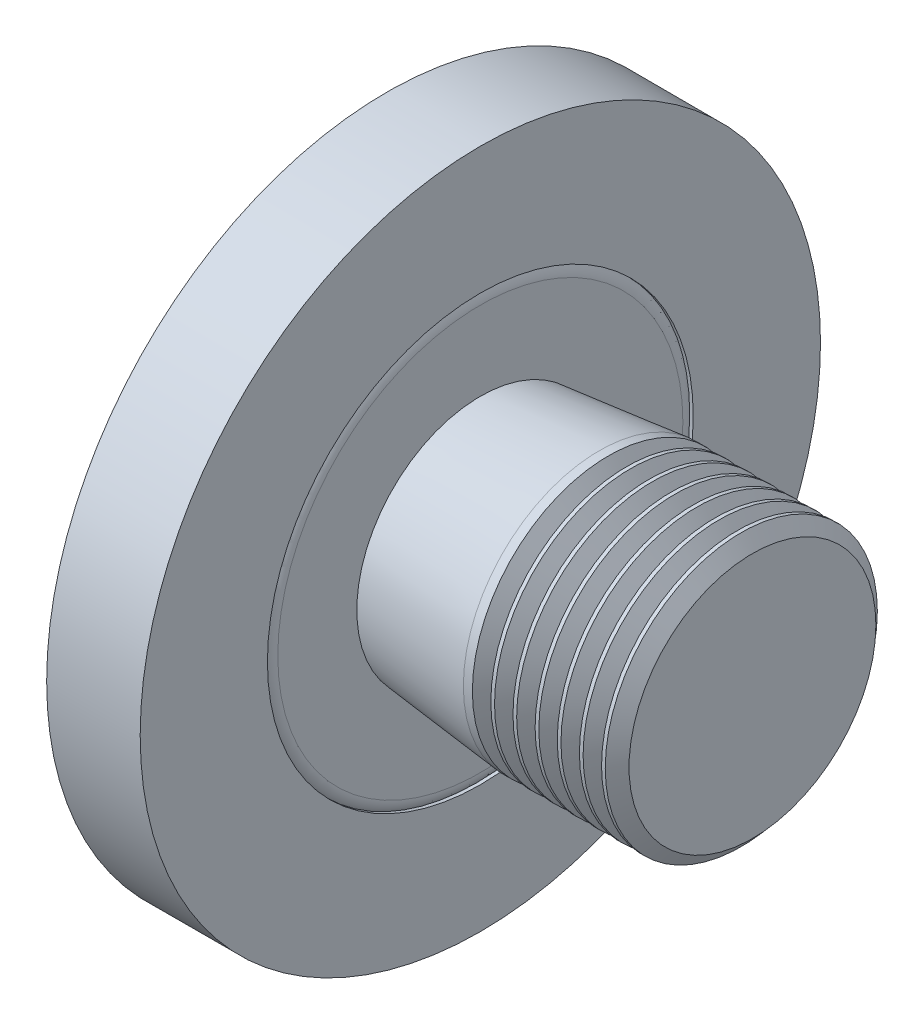
ISO-10303-21;
HEADER;
FILE_DESCRIPTION(('STEP AP214'),'2;1');
FILE_NAME('part.step','',(''),(''),'','','');
FILE_SCHEMA(('AUTOMOTIVE_DESIGN { 1 0 10303 214 1 1 1 1 }'));
ENDSEC;
DATA;
#1=APPLICATION_CONTEXT('core data for automotive mechanical design processes');
#2=APPLICATION_PROTOCOL_DEFINITION('international standard','automotive_design',2000,#1);
#3=PRODUCT_CONTEXT('',#1,'mechanical');
#4=PRODUCT('Part','Part','',(#3));
#5=PRODUCT_RELATED_PRODUCT_CATEGORY('part','',(#4));
#6=PRODUCT_DEFINITION_FORMATION('','',#4);
#7=PRODUCT_DEFINITION_CONTEXT('part definition',#1,'design');
#8=PRODUCT_DEFINITION('design','',#6,#7);
#9=PRODUCT_DEFINITION_SHAPE('','',#8);
#10=(LENGTH_UNIT() NAMED_UNIT(*) SI_UNIT(.MILLI.,.METRE.));
#11=(NAMED_UNIT(*) PLANE_ANGLE_UNIT() SI_UNIT($,.RADIAN.));
#12=(NAMED_UNIT(*) SI_UNIT($,.STERADIAN.) SOLID_ANGLE_UNIT());
#13=UNCERTAINTY_MEASURE_WITH_UNIT(LENGTH_MEASURE(1.E-05),#10,'distance_accuracy_value','');
#14=(GEOMETRIC_REPRESENTATION_CONTEXT(3) GLOBAL_UNCERTAINTY_ASSIGNED_CONTEXT((#13)) GLOBAL_UNIT_ASSIGNED_CONTEXT((#10,
#11,#12)) REPRESENTATION_CONTEXT('',''));
#15=CARTESIAN_POINT('',(0.,0.,0.));
#16=DIRECTION('',(0.,0.,1.));
#17=DIRECTION('',(1.,0.,0.));
#18=AXIS2_PLACEMENT_3D('',#15,#16,#17);
#19=CARTESIAN_POINT('',(0.45,0.,0.));
#20=DIRECTION('',(1.,0.,0.));
#21=DIRECTION('',(0.,0.,-1.));
#22=AXIS2_PLACEMENT_3D('',#19,#20,#21);
#23=TOROIDAL_SURFACE('',#22,1.19086914989307,0.1);
#24=CARTESIAN_POINT('',(0.55,0.,0.));
#25=DIRECTION('',(-1.,0.,0.));
#26=DIRECTION('',(0.,0.,-1.));
#27=AXIS2_PLACEMENT_3D('',#24,#25,#26);
#28=CIRCLE('',#27,1.19086914989307);
#29=CARTESIAN_POINT('',(0.55,0.,-1.19086914989307));
#30=VERTEX_POINT('',#29);
#31=CARTESIAN_POINT('',(0.55,0.,1.19086914989307));
#32=VERTEX_POINT('',#31);
#33=EDGE_CURVE('E135',#30,#32,#28,.T.);
#34=ORIENTED_EDGE('',*,*,#33,.T.);
#35=CARTESIAN_POINT('',(0.55,0.,0.));
#36=DIRECTION('',(-1.,0.,0.));
#37=DIRECTION('',(0.,0.,1.));
#38=AXIS2_PLACEMENT_3D('',#35,#36,#37);
#39=CIRCLE('',#38,1.19086914989307);
#40=EDGE_CURVE('E139',#32,#30,#39,.T.);
#41=ORIENTED_EDGE('',*,*,#40,.T.);
#42=EDGE_LOOP('',(#34,#41));
#43=FACE_BOUND('',#42,.T.);
#44=CARTESIAN_POINT('',(0.529230836567331,0.,0.));
#45=DIRECTION('',(1.,0.,0.));
#46=DIRECTION('',(0.,0.,-1.));
#47=AXIS2_PLACEMENT_3D('',#44,#45,#46);
#48=CIRCLE('',#47,1.25188123506348);
#49=CARTESIAN_POINT('',(0.529230836567331,0.,-1.25188123506348));
#50=VERTEX_POINT('',#49);
#51=EDGE_CURVE('E316',#50,#50,#48,.T.);
#52=ORIENTED_EDGE('',*,*,#51,.T.);
#53=EDGE_LOOP('',(#52));
#54=FACE_BOUND('',#53,.T.);
#55=ADVANCED_FACE('F31',(#43,#54),#23,.T.);
#56=CARTESIAN_POINT('',(2.19285000002856,0.,0.));
#57=DIRECTION('',(1.,0.,0.));
#58=DIRECTION('',(0.,0.,-1.));
#59=AXIS2_PLACEMENT_3D('',#56,#57,#58);
#60=CONICAL_SURFACE('',#59,0.800000000026557,1.04719755130005);
#61=CARTESIAN_POINT('',(2.13860000002342,0.,0.));
#62=DIRECTION('',(-1.,0.,0.));
#63=DIRECTION('',(0.,0.,1.));
#64=AXIS2_PLACEMENT_3D('',#61,#62,#63);
#65=CIRCLE('',#64,0.706036243741437);
#66=CARTESIAN_POINT('',(2.13860000002342,0.,0.706036243741437));
#67=VERTEX_POINT('',#66);
#68=EDGE_CURVE('E248',#67,#67,#65,.T.);
#69=ORIENTED_EDGE('',*,*,#68,.F.);
#70=EDGE_LOOP('',(#69));
#71=FACE_BOUND('',#70,.T.);
#72=CARTESIAN_POINT('',(2.15,0.,0.));
#73=DIRECTION('',(1.,0.,0.));
#74=DIRECTION('',(0.,0.,-1.));
#75=AXIS2_PLACEMENT_3D('',#72,#73,#74);
#76=CIRCLE('',#75,0.725781622855038);
#77=CARTESIAN_POINT('',(2.15,0.,-0.725781622855038));
#78=VERTEX_POINT('',#77);
#79=EDGE_CURVE('E35',#78,#78,#76,.F.);
#80=ORIENTED_EDGE('',*,*,#79,.T.);
#81=EDGE_LOOP('',(#80));
#82=FACE_BOUND('',#81,.T.);
#83=ADVANCED_FACE('F33',(#71,#82),#60,.T.);
#84=CARTESIAN_POINT('',(2.08435000001828,0.,0.));
#85=DIRECTION('',(-1.,0.,0.));
#86=DIRECTION('',(0.,0.,1.));
#87=AXIS2_PLACEMENT_3D('',#84,#85,#86);
#88=CONICAL_SURFACE('',#87,0.800000000026557,1.0471975510381);
#89=ORIENTED_EDGE('',*,*,#68,.T.);
#90=EDGE_LOOP('',(#89));
#91=FACE_BOUND('',#90,.T.);
#92=CARTESIAN_POINT('',(2.08435,0.,0.));
#93=DIRECTION('',(-1.,0.,0.));
#94=DIRECTION('',(0.,0.,1.));
#95=AXIS2_PLACEMENT_3D('',#92,#93,#94);
#96=CIRCLE('',#95,0.8);
#97=CARTESIAN_POINT('',(2.08435,0.,0.8));
#98=VERTEX_POINT('',#97);
#99=EDGE_CURVE('E245',#98,#98,#96,.T.);
#100=ORIENTED_EDGE('',*,*,#99,.F.);
#101=EDGE_LOOP('',(#100));
#102=FACE_BOUND('',#101,.T.);
#103=ADVANCED_FACE('F304',(#91,#102),#88,.T.);
#104=CARTESIAN_POINT('',(3.05,0.,0.));
#105=DIRECTION('',(-1.,0.,0.));
#106=DIRECTION('',(0.,0.,1.));
#107=AXIS2_PLACEMENT_3D('',#104,#105,#106);
#108=CYLINDRICAL_SURFACE('',#107,0.8);
#109=ORIENTED_EDGE('',*,*,#99,.T.);
#110=EDGE_LOOP('',(#109));
#111=FACE_BOUND('',#110,.T.);
#112=CARTESIAN_POINT('',(2.06265000002759,0.,0.));
#113=DIRECTION('',(1.,0.,0.));
#114=DIRECTION('',(0.,0.,-1.));
#115=AXIS2_PLACEMENT_3D('',#112,#113,#114);
#116=CIRCLE('',#115,0.800000000026557);
#117=CARTESIAN_POINT('',(2.06265000002759,0.,-0.800000000026557));
#118=VERTEX_POINT('',#117);
#119=EDGE_CURVE('E242',#118,#118,#116,.F.);
#120=ORIENTED_EDGE('',*,*,#119,.F.);
#121=EDGE_LOOP('',(#120));
#122=FACE_BOUND('',#121,.T.);
#123=ADVANCED_FACE('F309',(#111,#122),#108,.T.);
#124=CARTESIAN_POINT('',(2.06265000002759,0.,0.));
#125=DIRECTION('',(1.,0.,0.));
#126=DIRECTION('',(0.,0.,-1.));
#127=AXIS2_PLACEMENT_3D('',#124,#125,#126);
#128=CONICAL_SURFACE('',#127,0.800000000026557,1.04719755130005);
#129=CARTESIAN_POINT('',(2.00840000002245,0.,0.));
#130=DIRECTION('',(-1.,0.,0.));
#131=DIRECTION('',(0.,0.,1.));
#132=AXIS2_PLACEMENT_3D('',#129,#130,#131);
#133=CIRCLE('',#132,0.706036243684594);
#134=CARTESIAN_POINT('',(2.00840000002245,0.,0.706036243684594));
#135=VERTEX_POINT('',#134);
#136=EDGE_CURVE('E239',#135,#135,#133,.T.);
#137=ORIENTED_EDGE('',*,*,#136,.F.);
#138=EDGE_LOOP('',(#137));
#139=FACE_BOUND('',#138,.T.);
#140=ORIENTED_EDGE('',*,*,#119,.T.);
#141=EDGE_LOOP('',(#140));
#142=FACE_BOUND('',#141,.T.);
#143=ADVANCED_FACE('F677',(#139,#142),#128,.T.);
#144=CARTESIAN_POINT('',(1.95415000001731,0.,0.));
#145=DIRECTION('',(-1.,0.,0.));
#146=DIRECTION('',(0.,0.,1.));
#147=AXIS2_PLACEMENT_3D('',#144,#145,#146);
#148=CONICAL_SURFACE('',#147,0.800000000026557,1.04719755130005);
#149=ORIENTED_EDGE('',*,*,#136,.T.);
#150=EDGE_LOOP('',(#149));
#151=FACE_BOUND('',#150,.T.);
#152=CARTESIAN_POINT('',(1.95415,0.,0.));
#153=DIRECTION('',(-1.,0.,0.));
#154=DIRECTION('',(0.,0.,1.));
#155=AXIS2_PLACEMENT_3D('',#152,#153,#154);
#156=CIRCLE('',#155,0.8);
#157=CARTESIAN_POINT('',(1.95415,0.,0.8));
#158=VERTEX_POINT('',#157);
#159=EDGE_CURVE('E236',#158,#158,#156,.T.);
#160=ORIENTED_EDGE('',*,*,#159,.F.);
#161=EDGE_LOOP('',(#160));
#162=FACE_BOUND('',#161,.T.);
#163=ADVANCED_FACE('F686',(#151,#162),#148,.T.);
#164=CARTESIAN_POINT('',(3.05,0.,0.));
#165=DIRECTION('',(-1.,0.,0.));
#166=DIRECTION('',(0.,0.,1.));
#167=AXIS2_PLACEMENT_3D('',#164,#165,#166);
#168=CYLINDRICAL_SURFACE('',#167,0.8);
#169=ORIENTED_EDGE('',*,*,#159,.T.);
#170=EDGE_LOOP('',(#169));
#171=FACE_BOUND('',#170,.T.);
#172=CARTESIAN_POINT('',(1.93245000002662,0.,0.));
#173=DIRECTION('',(1.,0.,0.));
#174=DIRECTION('',(0.,0.,-1.));
#175=AXIS2_PLACEMENT_3D('',#172,#173,#174);
#176=CIRCLE('',#175,0.800000000026557);
#177=CARTESIAN_POINT('',(1.93245000002662,0.,-0.800000000026557));
#178=VERTEX_POINT('',#177);
#179=EDGE_CURVE('E233',#178,#178,#176,.F.);
#180=ORIENTED_EDGE('',*,*,#179,.F.);
#181=EDGE_LOOP('',(#180));
#182=FACE_BOUND('',#181,.T.);
#183=ADVANCED_FACE('F695',(#171,#182),#168,.T.);
#184=CARTESIAN_POINT('',(1.93245000002662,0.,0.));
#185=DIRECTION('',(1.,0.,0.));
#186=DIRECTION('',(0.,0.,-1.));
#187=AXIS2_PLACEMENT_3D('',#184,#185,#186);
#188=CONICAL_SURFACE('',#187,0.800000000026557,1.04719755130005);
#189=CARTESIAN_POINT('',(1.87820000002148,0.,0.));
#190=DIRECTION('',(-1.,0.,0.));
#191=DIRECTION('',(0.,0.,1.));
#192=AXIS2_PLACEMENT_3D('',#189,#190,#191);
#193=CIRCLE('',#192,0.706036243684594);
#194=CARTESIAN_POINT('',(1.87820000002148,0.,0.706036243684594));
#195=VERTEX_POINT('',#194);
#196=EDGE_CURVE('E230',#195,#195,#193,.T.);
#197=ORIENTED_EDGE('',*,*,#196,.F.);
#198=EDGE_LOOP('',(#197));
#199=FACE_BOUND('',#198,.T.);
#200=ORIENTED_EDGE('',*,*,#179,.T.);
#201=EDGE_LOOP('',(#200));
#202=FACE_BOUND('',#201,.T.);
#203=ADVANCED_FACE('F704',(#199,#202),#188,.T.);
#204=CARTESIAN_POINT('',(1.82395000001634,0.,0.));
#205=DIRECTION('',(-1.,0.,0.));
#206=DIRECTION('',(0.,0.,1.));
#207=AXIS2_PLACEMENT_3D('',#204,#205,#206);
#208=CONICAL_SURFACE('',#207,0.799999999969714,1.0471975510381);
#209=ORIENTED_EDGE('',*,*,#196,.T.);
#210=EDGE_LOOP('',(#209));
#211=FACE_BOUND('',#210,.T.);
#212=CARTESIAN_POINT('',(1.82395,0.,0.));
#213=DIRECTION('',(-1.,0.,0.));
#214=DIRECTION('',(0.,0.,1.));
#215=AXIS2_PLACEMENT_3D('',#212,#213,#214);
#216=CIRCLE('',#215,0.8);
#217=CARTESIAN_POINT('',(1.82395,0.,0.8));
#218=VERTEX_POINT('',#217);
#219=EDGE_CURVE('E227',#218,#218,#216,.T.);
#220=ORIENTED_EDGE('',*,*,#219,.F.);
#221=EDGE_LOOP('',(#220));
#222=FACE_BOUND('',#221,.T.);
#223=ADVANCED_FACE('F713',(#211,#222),#208,.T.);
#224=CARTESIAN_POINT('',(3.05,0.,0.));
#225=DIRECTION('',(-1.,0.,0.));
#226=DIRECTION('',(0.,0.,1.));
#227=AXIS2_PLACEMENT_3D('',#224,#225,#226);
#228=CYLINDRICAL_SURFACE('',#227,0.8);
#229=ORIENTED_EDGE('',*,*,#219,.T.);
#230=EDGE_LOOP('',(#229));
#231=FACE_BOUND('',#230,.T.);
#232=CARTESIAN_POINT('',(1.80225000002565,0.,0.));
#233=DIRECTION('',(1.,0.,0.));
#234=DIRECTION('',(0.,0.,-1.));
#235=AXIS2_PLACEMENT_3D('',#232,#233,#234);
#236=CIRCLE('',#235,0.800000000026557);
#237=CARTESIAN_POINT('',(1.80225000002565,0.,-0.800000000026557));
#238=VERTEX_POINT('',#237);
#239=EDGE_CURVE('E224',#238,#238,#236,.F.);
#240=ORIENTED_EDGE('',*,*,#239,.F.);
#241=EDGE_LOOP('',(#240));
#242=FACE_BOUND('',#241,.T.);
#243=ADVANCED_FACE('F722',(#231,#242),#228,.T.);
#244=CARTESIAN_POINT('',(1.80225000002565,0.,0.));
#245=DIRECTION('',(1.,0.,0.));
#246=DIRECTION('',(0.,1.,0.));
#247=AXIS2_PLACEMENT_3D('',#244,#245,#246);
#248=CONICAL_SURFACE('',#247,0.800000000026557,1.04719755130005);
#249=CARTESIAN_POINT('',(1.74800000002051,0.,0.));
#250=DIRECTION('',(-1.,0.,0.));
#251=DIRECTION('',(0.,0.,1.));
#252=AXIS2_PLACEMENT_3D('',#249,#250,#251);
#253=CIRCLE('',#252,0.706036243684594);
#254=CARTESIAN_POINT('',(1.74800000002051,0.,0.706036243684594));
#255=VERTEX_POINT('',#254);
#256=EDGE_CURVE('E221',#255,#255,#253,.T.);
#257=ORIENTED_EDGE('',*,*,#256,.F.);
#258=EDGE_LOOP('',(#257));
#259=FACE_BOUND('',#258,.T.);
#260=ORIENTED_EDGE('',*,*,#239,.T.);
#261=EDGE_LOOP('',(#260));
#262=FACE_BOUND('',#261,.T.);
#263=ADVANCED_FACE('F731',(#259,#262),#248,.T.);
#264=CARTESIAN_POINT('',(1.69375000001537,0.,0.));
#265=DIRECTION('',(-1.,0.,0.));
#266=DIRECTION('',(0.,0.,1.));
#267=AXIS2_PLACEMENT_3D('',#264,#265,#266);
#268=CONICAL_SURFACE('',#267,0.799999999969714,1.0471975510381);
#269=ORIENTED_EDGE('',*,*,#256,.T.);
#270=EDGE_LOOP('',(#269));
#271=FACE_BOUND('',#270,.T.);
#272=CARTESIAN_POINT('',(1.69375,0.,0.));
#273=DIRECTION('',(-1.,0.,0.));
#274=DIRECTION('',(0.,0.,1.));
#275=AXIS2_PLACEMENT_3D('',#272,#273,#274);
#276=CIRCLE('',#275,0.8);
#277=CARTESIAN_POINT('',(1.69375,0.,0.8));
#278=VERTEX_POINT('',#277);
#279=EDGE_CURVE('E218',#278,#278,#276,.T.);
#280=ORIENTED_EDGE('',*,*,#279,.F.);
#281=EDGE_LOOP('',(#280));
#282=FACE_BOUND('',#281,.T.);
#283=ADVANCED_FACE('F740',(#271,#282),#268,.T.);
#284=CARTESIAN_POINT('',(3.05,0.,0.));
#285=DIRECTION('',(-1.,0.,0.));
#286=DIRECTION('',(0.,0.,1.));
#287=AXIS2_PLACEMENT_3D('',#284,#285,#286);
#288=CYLINDRICAL_SURFACE('',#287,0.8);
#289=ORIENTED_EDGE('',*,*,#279,.T.);
#290=EDGE_LOOP('',(#289));
#291=FACE_BOUND('',#290,.T.);
#292=CARTESIAN_POINT('',(1.67205000002468,0.,0.));
#293=DIRECTION('',(1.,0.,0.));
#294=DIRECTION('',(0.,0.,-1.));
#295=AXIS2_PLACEMENT_3D('',#292,#293,#294);
#296=CIRCLE('',#295,0.800000000026557);
#297=CARTESIAN_POINT('',(1.67205000002468,0.,-0.800000000026557));
#298=VERTEX_POINT('',#297);
#299=EDGE_CURVE('E215',#298,#298,#296,.F.);
#300=ORIENTED_EDGE('',*,*,#299,.F.);
#301=EDGE_LOOP('',(#300));
#302=FACE_BOUND('',#301,.T.);
#303=ADVANCED_FACE('F749',(#291,#302),#288,.T.);
#304=CARTESIAN_POINT('',(1.67205000002468,0.,0.));
#305=DIRECTION('',(1.,0.,0.));
#306=DIRECTION('',(0.,0.,-1.));
#307=AXIS2_PLACEMENT_3D('',#304,#305,#306);
#308=CONICAL_SURFACE('',#307,0.800000000026557,1.04719755130005);
#309=CARTESIAN_POINT('',(1.61780000001954,0.,0.));
#310=DIRECTION('',(-1.,0.,0.));
#311=DIRECTION('',(0.,0.,1.));
#312=AXIS2_PLACEMENT_3D('',#309,#310,#311);
#313=CIRCLE('',#312,0.706036243684594);
#314=CARTESIAN_POINT('',(1.61780000001954,0.,0.706036243684594));
#315=VERTEX_POINT('',#314);
#316=EDGE_CURVE('E212',#315,#315,#313,.T.);
#317=ORIENTED_EDGE('',*,*,#316,.F.);
#318=EDGE_LOOP('',(#317));
#319=FACE_BOUND('',#318,.T.);
#320=ORIENTED_EDGE('',*,*,#299,.T.);
#321=EDGE_LOOP('',(#320));
#322=FACE_BOUND('',#321,.T.);
#323=ADVANCED_FACE('F758',(#319,#322),#308,.T.);
#324=CARTESIAN_POINT('',(1.5635500000144,0.,0.));
#325=DIRECTION('',(-1.,0.,0.));
#326=DIRECTION('',(0.,-1.,0.));
#327=AXIS2_PLACEMENT_3D('',#324,#325,#326);
#328=CONICAL_SURFACE('',#327,0.799999999969714,1.0471975510381);
#329=ORIENTED_EDGE('',*,*,#316,.T.);
#330=EDGE_LOOP('',(#329));
#331=FACE_BOUND('',#330,.T.);
#332=CARTESIAN_POINT('',(1.56355,0.,0.));
#333=DIRECTION('',(-1.,0.,0.));
#334=DIRECTION('',(0.,0.,1.));
#335=AXIS2_PLACEMENT_3D('',#332,#333,#334);
#336=CIRCLE('',#335,0.8);
#337=CARTESIAN_POINT('',(1.56355,0.,0.8));
#338=VERTEX_POINT('',#337);
#339=EDGE_CURVE('E209',#338,#338,#336,.T.);
#340=ORIENTED_EDGE('',*,*,#339,.F.);
#341=EDGE_LOOP('',(#340));
#342=FACE_BOUND('',#341,.T.);
#343=ADVANCED_FACE('F767',(#331,#342),#328,.T.);
#344=CARTESIAN_POINT('',(3.05,0.,0.));
#345=DIRECTION('',(-1.,0.,0.));
#346=DIRECTION('',(0.,0.,1.));
#347=AXIS2_PLACEMENT_3D('',#344,#345,#346);
#348=CYLINDRICAL_SURFACE('',#347,0.8);
#349=ORIENTED_EDGE('',*,*,#339,.T.);
#350=EDGE_LOOP('',(#349));
#351=FACE_BOUND('',#350,.T.);
#352=CARTESIAN_POINT('',(1.54185000002371,0.,0.));
#353=DIRECTION('',(1.,0.,0.));
#354=DIRECTION('',(0.,0.,-1.));
#355=AXIS2_PLACEMENT_3D('',#352,#353,#354);
#356=CIRCLE('',#355,0.800000000026557);
#357=CARTESIAN_POINT('',(1.54185000002371,0.,-0.800000000026557));
#358=VERTEX_POINT('',#357);
#359=EDGE_CURVE('E206',#358,#358,#356,.F.);
#360=ORIENTED_EDGE('',*,*,#359,.F.);
#361=EDGE_LOOP('',(#360));
#362=FACE_BOUND('',#361,.T.);
#363=ADVANCED_FACE('F776',(#351,#362),#348,.T.);
#364=CARTESIAN_POINT('',(1.54185000002371,0.,0.));
#365=DIRECTION('',(1.,0.,0.));
#366=DIRECTION('',(0.,0.,-1.));
#367=AXIS2_PLACEMENT_3D('',#364,#365,#366);
#368=CONICAL_SURFACE('',#367,0.800000000026557,1.04719755130005);
#369=CARTESIAN_POINT('',(1.48760000001857,0.,0.));
#370=DIRECTION('',(-1.,0.,0.));
#371=DIRECTION('',(0.,0.,1.));
#372=AXIS2_PLACEMENT_3D('',#369,#370,#371);
#373=CIRCLE('',#372,0.706036243684594);
#374=CARTESIAN_POINT('',(1.48760000001857,0.,0.706036243684594));
#375=VERTEX_POINT('',#374);
#376=EDGE_CURVE('E203',#375,#375,#373,.T.);
#377=ORIENTED_EDGE('',*,*,#376,.F.);
#378=EDGE_LOOP('',(#377));
#379=FACE_BOUND('',#378,.T.);
#380=ORIENTED_EDGE('',*,*,#359,.T.);
#381=EDGE_LOOP('',(#380));
#382=FACE_BOUND('',#381,.T.);
#383=ADVANCED_FACE('F785',(#379,#382),#368,.T.);
#384=CARTESIAN_POINT('',(1.43335000001343,0.,0.));
#385=DIRECTION('',(-1.,0.,0.));
#386=DIRECTION('',(0.,0.,1.));
#387=AXIS2_PLACEMENT_3D('',#384,#385,#386);
#388=CONICAL_SURFACE('',#387,0.799999999969714,1.0471975510381);
#389=ORIENTED_EDGE('',*,*,#376,.T.);
#390=EDGE_LOOP('',(#389));
#391=FACE_BOUND('',#390,.T.);
#392=CARTESIAN_POINT('',(1.43335,0.,0.));
#393=DIRECTION('',(-1.,0.,0.));
#394=DIRECTION('',(0.,0.,1.));
#395=AXIS2_PLACEMENT_3D('',#392,#393,#394);
#396=CIRCLE('',#395,0.8);
#397=CARTESIAN_POINT('',(1.43335,0.,0.8));
#398=VERTEX_POINT('',#397);
#399=EDGE_CURVE('E200',#398,#398,#396,.T.);
#400=ORIENTED_EDGE('',*,*,#399,.F.);
#401=EDGE_LOOP('',(#400));
#402=FACE_BOUND('',#401,.T.);
#403=ADVANCED_FACE('F794',(#391,#402),#388,.T.);
#404=CARTESIAN_POINT('',(3.05,0.,0.));
#405=DIRECTION('',(-1.,0.,0.));
#406=DIRECTION('',(0.,0.,1.));
#407=AXIS2_PLACEMENT_3D('',#404,#405,#406);
#408=CYLINDRICAL_SURFACE('',#407,0.8);
#409=ORIENTED_EDGE('',*,*,#399,.T.);
#410=EDGE_LOOP('',(#409));
#411=FACE_BOUND('',#410,.T.);
#412=CARTESIAN_POINT('',(1.41165000002275,0.,0.));
#413=DIRECTION('',(1.,0.,0.));
#414=DIRECTION('',(0.,0.,-1.));
#415=AXIS2_PLACEMENT_3D('',#412,#413,#414);
#416=CIRCLE('',#415,0.800000000026557);
#417=CARTESIAN_POINT('',(1.41165000002275,0.,-0.800000000026557));
#418=VERTEX_POINT('',#417);
#419=EDGE_CURVE('E197',#418,#418,#416,.F.);
#420=ORIENTED_EDGE('',*,*,#419,.F.);
#421=EDGE_LOOP('',(#420));
#422=FACE_BOUND('',#421,.T.);
#423=ADVANCED_FACE('F803',(#411,#422),#408,.T.);
#424=CARTESIAN_POINT('',(1.41165000002275,0.,0.));
#425=DIRECTION('',(1.,0.,0.));
#426=DIRECTION('',(0.,0.,-1.));
#427=AXIS2_PLACEMENT_3D('',#424,#425,#426);
#428=CONICAL_SURFACE('',#427,0.800000000026557,1.04719755130005);
#429=CARTESIAN_POINT('',(1.35740000001761,0.,0.));
#430=DIRECTION('',(-1.,0.,0.));
#431=DIRECTION('',(0.,0.,1.));
#432=AXIS2_PLACEMENT_3D('',#429,#430,#431);
#433=CIRCLE('',#432,0.706036243684594);
#434=CARTESIAN_POINT('',(1.35740000001761,0.,0.706036243684594));
#435=VERTEX_POINT('',#434);
#436=EDGE_CURVE('E194',#435,#435,#433,.T.);
#437=ORIENTED_EDGE('',*,*,#436,.F.);
#438=EDGE_LOOP('',(#437));
#439=FACE_BOUND('',#438,.T.);
#440=ORIENTED_EDGE('',*,*,#419,.T.);
#441=EDGE_LOOP('',(#440));
#442=FACE_BOUND('',#441,.T.);
#443=ADVANCED_FACE('F297',(#439,#442),#428,.T.);
#444=CARTESIAN_POINT('',(1.30315000001247,0.,0.));
#445=DIRECTION('',(-1.,0.,0.));
#446=DIRECTION('',(0.,0.,1.));
#447=AXIS2_PLACEMENT_3D('',#444,#445,#446);
#448=CONICAL_SURFACE('',#447,0.799999999969714,1.0471975510381);
#449=ORIENTED_EDGE('',*,*,#436,.T.);
#450=EDGE_LOOP('',(#449));
#451=FACE_BOUND('',#450,.T.);
#452=CARTESIAN_POINT('',(1.30315,0.,0.));
#453=DIRECTION('',(-1.,0.,0.));
#454=DIRECTION('',(0.,0.,1.));
#455=AXIS2_PLACEMENT_3D('',#452,#453,#454);
#456=CIRCLE('',#455,0.8);
#457=CARTESIAN_POINT('',(1.30315,0.,0.8));
#458=VERTEX_POINT('',#457);
#459=EDGE_CURVE('E191',#458,#458,#456,.T.);
#460=ORIENTED_EDGE('',*,*,#459,.F.);
#461=EDGE_LOOP('',(#460));
#462=FACE_BOUND('',#461,.T.);
#463=ADVANCED_FACE('F292',(#451,#462),#448,.T.);
#464=CARTESIAN_POINT('',(3.05,0.,0.));
#465=DIRECTION('',(-1.,0.,0.));
#466=DIRECTION('',(0.,0.,1.));
#467=AXIS2_PLACEMENT_3D('',#464,#465,#466);
#468=CYLINDRICAL_SURFACE('',#467,0.8);
#469=ORIENTED_EDGE('',*,*,#459,.T.);
#470=EDGE_LOOP('',(#469));
#471=FACE_BOUND('',#470,.T.);
#472=CARTESIAN_POINT('',(1.25000000002728,0.,0.));
#473=DIRECTION('',(1.,0.,0.));
#474=DIRECTION('',(0.,0.,-1.));
#475=AXIS2_PLACEMENT_3D('',#472,#473,#474);
#476=CIRCLE('',#475,0.799999999998136);
#477=CARTESIAN_POINT('',(1.25000000002728,0.,-0.799999999998136));
#478=VERTEX_POINT('',#477);
#479=EDGE_CURVE('E183',#478,#478,#476,.F.);
#480=ORIENTED_EDGE('',*,*,#479,.F.);
#481=EDGE_LOOP('',(#480));
#482=FACE_BOUND('',#481,.T.);
#483=ADVANCED_FACE('F288',(#471,#482),#468,.T.);
#484=CARTESIAN_POINT('',(1.25000000002728,0.,0.));
#485=DIRECTION('',(1.,0.,0.));
#486=DIRECTION('',(0.,0.,-1.));
#487=AXIS2_PLACEMENT_3D('',#484,#485,#486);
#488=CONICAL_SURFACE('',#487,0.799999999998136,0.104719755122848);
#489=CARTESIAN_POINT('',(0.549999999975626,0.,0.));
#490=DIRECTION('',(1.,0.,0.));
#491=DIRECTION('',(0.,0.,-1.));
#492=AXIS2_PLACEMENT_3D('',#489,#490,#491);
#493=CIRCLE('',#492,0.726427035304476);
#494=CARTESIAN_POINT('',(0.549999999975626,0.,-0.726427035304476));
#495=VERTEX_POINT('',#494);
#496=EDGE_CURVE('E143',#495,#495,#493,.F.);
#497=ORIENTED_EDGE('',*,*,#496,.F.);
#498=EDGE_LOOP('',(#497));
#499=FACE_BOUND('',#498,.T.);
#500=ORIENTED_EDGE('',*,*,#479,.T.);
#501=EDGE_LOOP('',(#500));
#502=FACE_BOUND('',#501,.T.);
#503=ADVANCED_FACE('F166',(#499,#502),#488,.T.);
#504=CARTESIAN_POINT('',(0.55,0.,0.));
#505=DIRECTION('',(1.,0.,0.));
#506=DIRECTION('',(0.,0.,-1.));
#507=AXIS2_PLACEMENT_3D('',#504,#505,#506);
#508=PLANE('',#507);
#509=ORIENTED_EDGE('',*,*,#496,.T.);
#510=EDGE_LOOP('',(#509));
#511=FACE_BOUND('',#510,.T.);
#512=ORIENTED_EDGE('',*,*,#40,.F.);
#513=ORIENTED_EDGE('',*,*,#33,.F.);
#514=EDGE_LOOP('',(#512,#513));
#515=FACE_BOUND('',#514,.T.);
#516=ADVANCED_FACE('F146',(#511,#515),#508,.T.);
#517=CARTESIAN_POINT('',(2.15,0.,0.));
#518=DIRECTION('',(1.,0.,0.));
#519=DIRECTION('',(0.,0.,-1.));
#520=AXIS2_PLACEMENT_3D('',#517,#518,#519);
#521=PLANE('',#520);
#522=ORIENTED_EDGE('',*,*,#79,.F.);
#523=EDGE_LOOP('',(#522));
#524=FACE_BOUND('',#523,.T.);
#525=ADVANCED_FACE('F165',(#524),#521,.T.);
#526=CARTESIAN_POINT('',(6.20685424949238,0.,0.));
#527=DIRECTION('',(-1.,0.,0.));
#528=DIRECTION('',(0.,0.,1.));
#529=AXIS2_PLACEMENT_3D('',#526,#527,#528);
#530=CYLINDRICAL_SURFACE('',#529,2.);
#531=CARTESIAN_POINT('',(0.,0.,0.));
#532=DIRECTION('',(-1.,0.,0.));
#533=DIRECTION('',(0.,0.,1.));
#534=AXIS2_PLACEMENT_3D('',#531,#532,#533);
#535=CIRCLE('',#534,2.);
#536=CARTESIAN_POINT('',(0.,0.,2.));
#537=VERTEX_POINT('',#536);
#538=EDGE_CURVE('E322',#537,#537,#535,.T.);
#539=ORIENTED_EDGE('',*,*,#538,.F.);
#540=EDGE_LOOP('',(#539));
#541=FACE_BOUND('',#540,.T.);
#542=CARTESIAN_POINT('',(0.55,0.,0.));
#543=DIRECTION('',(1.,0.,0.));
#544=DIRECTION('',(0.,0.,-1.));
#545=AXIS2_PLACEMENT_3D('',#542,#543,#544);
#546=CIRCLE('',#545,2.);
#547=CARTESIAN_POINT('',(0.55,0.,-2.));
#548=VERTEX_POINT('',#547);
#549=EDGE_CURVE('E987',#548,#548,#546,.F.);
#550=ORIENTED_EDGE('',*,*,#549,.T.);
#551=EDGE_LOOP('',(#550));
#552=FACE_BOUND('',#551,.T.);
#553=ADVANCED_FACE('F595',(#541,#552),#530,.T.);
#554=CARTESIAN_POINT('',(6.20685424949238,0.,0.));
#555=DIRECTION('',(-1.,0.,0.));
#556=DIRECTION('',(0.,0.,1.));
#557=AXIS2_PLACEMENT_3D('',#554,#555,#556);
#558=CYLINDRICAL_SURFACE('',#557,1.25188123506348);
#559=ORIENTED_EDGE('',*,*,#51,.F.);
#560=EDGE_LOOP('',(#559));
#561=FACE_BOUND('',#560,.T.);
#562=CARTESIAN_POINT('',(0.55,0.,0.));
#563=DIRECTION('',(1.,0.,0.));
#564=DIRECTION('',(0.,0.,-1.));
#565=AXIS2_PLACEMENT_3D('',#562,#563,#564);
#566=CIRCLE('',#565,1.25188123506348);
#567=CARTESIAN_POINT('',(0.55,0.,-1.25188123506348));
#568=VERTEX_POINT('',#567);
#569=EDGE_CURVE('E318',#568,#568,#566,.F.);
#570=ORIENTED_EDGE('',*,*,#569,.F.);
#571=EDGE_LOOP('',(#570));
#572=FACE_BOUND('',#571,.T.);
#573=ADVANCED_FACE('F589',(#561,#572),#558,.F.);
#574=CARTESIAN_POINT('',(0.55,0.,0.));
#575=DIRECTION('',(1.,0.,0.));
#576=DIRECTION('',(0.,0.,-1.));
#577=AXIS2_PLACEMENT_3D('',#574,#575,#576);
#578=PLANE('',#577);
#579=ORIENTED_EDGE('',*,*,#549,.F.);
#580=EDGE_LOOP('',(#579));
#581=FACE_BOUND('',#580,.T.);
#582=ORIENTED_EDGE('',*,*,#569,.T.);
#583=EDGE_LOOP('',(#582));
#584=FACE_BOUND('',#583,.T.);
#585=ADVANCED_FACE('F583',(#581,#584),#578,.T.);
#586=CARTESIAN_POINT('',(0.33,0.15,0.15));
#587=DIRECTION('',(1.,0.,0.));
#588=DIRECTION('',(0.,0.,-1.));
#589=AXIS2_PLACEMENT_3D('',#586,#587,#588);
#590=PLANE('',#589);
#591=DIRECTION('',(0.,0.,1.));
#592=VECTOR('',#591,1.);
#593=CARTESIAN_POINT('',(0.33,0.559474411167423,0.15));
#594=LINE('',#593,#592);
#595=CARTESIAN_POINT('',(0.33,0.559474411167423,-0.15));
#596=VERTEX_POINT('',#595);
#597=CARTESIAN_POINT('',(0.33,0.559474411167423,0.15));
#598=VERTEX_POINT('',#597);
#599=EDGE_CURVE('E384',#596,#598,#594,.T.);
#600=ORIENTED_EDGE('',*,*,#599,.F.);
#601=DIRECTION('',(0.,-1.,0.));
#602=VECTOR('',#601,1.);
#603=CARTESIAN_POINT('',(0.33,0.75,-0.15));
#604=LINE('',#603,#602);
#605=CARTESIAN_POINT('',(0.33,0.35,-0.15));
#606=VERTEX_POINT('',#605);
#607=EDGE_CURVE('E374',#606,#596,#604,.F.);
#608=ORIENTED_EDGE('',*,*,#607,.F.);
#609=CARTESIAN_POINT('',(0.33,0.35,-0.35));
#610=DIRECTION('',(-1.,0.,0.));
#611=DIRECTION('',(0.,0.,1.));
#612=AXIS2_PLACEMENT_3D('',#609,#610,#611);
#613=CIRCLE('',#612,0.2);
#614=CARTESIAN_POINT('',(0.33,0.15,-0.35));
#615=VERTEX_POINT('',#614);
#616=EDGE_CURVE('E269',#615,#606,#613,.T.);
#617=ORIENTED_EDGE('',*,*,#616,.F.);
#618=DIRECTION('',(0.,0.,-1.));
#619=VECTOR('',#618,1.);
#620=CARTESIAN_POINT('',(0.33,0.15,-0.15));
#621=LINE('',#620,#619);
#622=CARTESIAN_POINT('',(0.33,0.15,-0.559474411167423));
#623=VERTEX_POINT('',#622);
#624=EDGE_CURVE('E362',#623,#615,#621,.F.);
#625=ORIENTED_EDGE('',*,*,#624,.F.);
#626=DIRECTION('',(0.,1.,0.));
#627=VECTOR('',#626,1.);
#628=CARTESIAN_POINT('',(0.33,0.15,-0.559474411167423));
#629=LINE('',#628,#627);
#630=CARTESIAN_POINT('',(0.33,-0.15,-0.559474411167423));
#631=VERTEX_POINT('',#630);
#632=EDGE_CURVE('E147',#631,#623,#629,.T.);
#633=ORIENTED_EDGE('',*,*,#632,.F.);
#634=DIRECTION('',(0.,0.,1.));
#635=VECTOR('',#634,1.);
#636=CARTESIAN_POINT('',(0.33,-0.15,-0.15));
#637=LINE('',#636,#635);
#638=CARTESIAN_POINT('',(0.33,-0.15,-0.35));
#639=VERTEX_POINT('',#638);
#640=EDGE_CURVE('E125',#639,#631,#637,.F.);
#641=ORIENTED_EDGE('',*,*,#640,.F.);
#642=CARTESIAN_POINT('',(0.33,-0.35,-0.35));
#643=DIRECTION('',(-1.,0.,0.));
#644=DIRECTION('',(0.,0.,1.));
#645=AXIS2_PLACEMENT_3D('',#642,#643,#644);
#646=CIRCLE('',#645,0.2);
#647=CARTESIAN_POINT('',(0.33,-0.35,-0.15));
#648=VERTEX_POINT('',#647);
#649=EDGE_CURVE('E117',#648,#639,#646,.T.);
#650=ORIENTED_EDGE('',*,*,#649,.F.);
#651=DIRECTION('',(0.,1.,0.));
#652=VECTOR('',#651,1.);
#653=CARTESIAN_POINT('',(0.33,-0.15,-0.15));
#654=LINE('',#653,#652);
#655=CARTESIAN_POINT('',(0.33,-0.559474411167423,-0.15));
#656=VERTEX_POINT('',#655);
#657=EDGE_CURVE('E109',#656,#648,#654,.T.);
#658=ORIENTED_EDGE('',*,*,#657,.F.);
#659=DIRECTION('',(0.,0.,1.));
#660=VECTOR('',#659,1.);
#661=CARTESIAN_POINT('',(0.33,-0.559474411167423,0.15));
#662=LINE('',#661,#660);
#663=CARTESIAN_POINT('',(0.33,-0.559474411167423,0.15));
#664=VERTEX_POINT('',#663);
#665=EDGE_CURVE('E422',#664,#656,#662,.F.);
#666=ORIENTED_EDGE('',*,*,#665,.F.);
#667=DIRECTION('',(0.,1.,0.));
#668=VECTOR('',#667,1.);
#669=CARTESIAN_POINT('',(0.33,-0.15,0.15));
#670=LINE('',#669,#668);
#671=CARTESIAN_POINT('',(0.33,-0.35,0.15));
#672=VERTEX_POINT('',#671);
#673=EDGE_CURVE('E412',#672,#664,#670,.F.);
#674=ORIENTED_EDGE('',*,*,#673,.F.);
#675=CARTESIAN_POINT('',(0.33,-0.35,0.35));
#676=DIRECTION('',(-1.,0.,0.));
#677=DIRECTION('',(0.,0.,1.));
#678=AXIS2_PLACEMENT_3D('',#675,#676,#677);
#679=CIRCLE('',#678,0.2);
#680=CARTESIAN_POINT('',(0.33,-0.15,0.35));
#681=VERTEX_POINT('',#680);
#682=EDGE_CURVE('E277',#681,#672,#679,.T.);
#683=ORIENTED_EDGE('',*,*,#682,.F.);
#684=DIRECTION('',(0.,0.,1.));
#685=VECTOR('',#684,1.);
#686=CARTESIAN_POINT('',(0.33,-0.15,0.75));
#687=LINE('',#686,#685);
#688=CARTESIAN_POINT('',(0.33,-0.15,0.559474411167423));
#689=VERTEX_POINT('',#688);
#690=EDGE_CURVE('E408',#689,#681,#687,.F.);
#691=ORIENTED_EDGE('',*,*,#690,.F.);
#692=DIRECTION('',(0.,1.,0.));
#693=VECTOR('',#692,1.);
#694=CARTESIAN_POINT('',(0.33,0.15,0.559474411167423));
#695=LINE('',#694,#693);
#696=CARTESIAN_POINT('',(0.33,0.15,0.559474411167423));
#697=VERTEX_POINT('',#696);
#698=EDGE_CURVE('E403',#697,#689,#695,.F.);
#699=ORIENTED_EDGE('',*,*,#698,.F.);
#700=DIRECTION('',(0.,0.,-1.));
#701=VECTOR('',#700,1.);
#702=CARTESIAN_POINT('',(0.33,0.15,0.75));
#703=LINE('',#702,#701);
#704=CARTESIAN_POINT('',(0.33,0.15,0.35));
#705=VERTEX_POINT('',#704);
#706=EDGE_CURVE('E393',#705,#697,#703,.F.);
#707=ORIENTED_EDGE('',*,*,#706,.F.);
#708=CARTESIAN_POINT('',(0.33,0.35,0.35));
#709=DIRECTION('',(-1.,0.,0.));
#710=DIRECTION('',(0.,0.,1.));
#711=AXIS2_PLACEMENT_3D('',#708,#709,#710);
#712=CIRCLE('',#711,0.2);
#713=CARTESIAN_POINT('',(0.33,0.35,0.15));
#714=VERTEX_POINT('',#713);
#715=EDGE_CURVE('E273',#714,#705,#712,.T.);
#716=ORIENTED_EDGE('',*,*,#715,.F.);
#717=DIRECTION('',(0.,1.,0.));
#718=VECTOR('',#717,1.);
#719=CARTESIAN_POINT('',(0.33,0.75,0.15));
#720=LINE('',#719,#718);
#721=EDGE_CURVE('E389',#598,#714,#720,.F.);
#722=ORIENTED_EDGE('',*,*,#721,.F.);
#723=EDGE_LOOP('',(#600,#608,#617,#625,#633,#641,#650,#658,#666,#674,#683,#691,#699,#707,#716,#722));
#724=FACE_BOUND('',#723,.T.);
#725=ADVANCED_FACE('F479',(#724),#590,.F.);
#726=CARTESIAN_POINT('',(0.33,0.15,-0.15));
#727=DIRECTION('',(0.,-1.,0.));
#728=DIRECTION('',(0.,0.,-1.));
#729=AXIS2_PLACEMENT_3D('',#726,#727,#728);
#730=PLANE('',#729);
#731=DIRECTION('',(0.,0.,-1.));
#732=VECTOR('',#731,1.);
#733=CARTESIAN_POINT('',(0.,0.15,0.));
#734=LINE('',#733,#732);
#735=CARTESIAN_POINT('',(0.,0.15,-0.35));
#736=VERTEX_POINT('',#735);
#737=CARTESIAN_POINT('',(0.,0.15,-0.75));
#738=VERTEX_POINT('',#737);
#739=EDGE_CURVE('E11',#736,#738,#734,.T.);
#740=ORIENTED_EDGE('',*,*,#739,.T.);
#741=DIRECTION('',(0.866025403784438,0.,0.500000000000001));
#742=VECTOR('',#741,1.);
#743=CARTESIAN_POINT('',(0.,0.15,-0.75));
#744=LINE('',#743,#742);
#745=EDGE_CURVE('E361',#738,#623,#744,.T.);
#746=ORIENTED_EDGE('',*,*,#745,.T.);
#747=ORIENTED_EDGE('',*,*,#624,.T.);
#748=DIRECTION('',(1.,0.,0.));
#749=VECTOR('',#748,1.);
#750=CARTESIAN_POINT('',(0.33,0.15,-0.35));
#751=LINE('',#750,#749);
#752=EDGE_CURVE('E49',#615,#736,#751,.F.);
#753=ORIENTED_EDGE('',*,*,#752,.T.);
#754=EDGE_LOOP('',(#740,#746,#747,#753));
#755=FACE_BOUND('',#754,.T.);
#756=ADVANCED_FACE('F499',(#755),#730,.T.);
#757=CARTESIAN_POINT('',(0.,0.15,-0.75));
#758=DIRECTION('',(-0.500000000000001,0.,0.866025403784438));
#759=DIRECTION('',(0.866025403784438,0.,0.500000000000001));
#760=AXIS2_PLACEMENT_3D('',#757,#758,#759);
#761=PLANE('',#760);
#762=ORIENTED_EDGE('',*,*,#632,.T.);
#763=ORIENTED_EDGE('',*,*,#745,.F.);
#764=DIRECTION('',(0.,1.,0.));
#765=VECTOR('',#764,1.);
#766=CARTESIAN_POINT('',(0.,0.,-0.75));
#767=LINE('',#766,#765);
#768=CARTESIAN_POINT('',(0.,-0.15,-0.75));
#769=VERTEX_POINT('',#768);
#770=EDGE_CURVE('E357',#738,#769,#767,.F.);
#771=ORIENTED_EDGE('',*,*,#770,.T.);
#772=DIRECTION('',(-0.866025403784438,0.,-0.500000000000001));
#773=VECTOR('',#772,1.);
#774=CARTESIAN_POINT('',(0.33,-0.15,-0.559474411167423));
#775=LINE('',#774,#773);
#776=EDGE_CURVE('E282',#631,#769,#775,.T.);
#777=ORIENTED_EDGE('',*,*,#776,.F.);
#778=EDGE_LOOP('',(#762,#763,#771,#777));
#779=FACE_BOUND('',#778,.T.);
#780=ADVANCED_FACE('F496',(#779),#761,.T.);
#781=CARTESIAN_POINT('',(0.33,-0.15,-0.15));
#782=DIRECTION('',(0.,1.,0.));
#783=DIRECTION('',(0.,0.,1.));
#784=AXIS2_PLACEMENT_3D('',#781,#782,#783);
#785=PLANE('',#784);
#786=ORIENTED_EDGE('',*,*,#640,.T.);
#787=ORIENTED_EDGE('',*,*,#776,.T.);
#788=DIRECTION('',(0.,0.,-1.));
#789=VECTOR('',#788,1.);
#790=CARTESIAN_POINT('',(0.,-0.15,0.));
#791=LINE('',#790,#789);
#792=CARTESIAN_POINT('',(0.,-0.15,-0.35));
#793=VERTEX_POINT('',#792);
#794=EDGE_CURVE('E268',#769,#793,#791,.F.);
#795=ORIENTED_EDGE('',*,*,#794,.T.);
#796=DIRECTION('',(-1.,0.,0.));
#797=VECTOR('',#796,1.);
#798=CARTESIAN_POINT('',(0.33,-0.15,-0.35));
#799=LINE('',#798,#797);
#800=EDGE_CURVE('E281',#639,#793,#799,.T.);
#801=ORIENTED_EDGE('',*,*,#800,.F.);
#802=EDGE_LOOP('',(#786,#787,#795,#801));
#803=FACE_BOUND('',#802,.T.);
#804=ADVANCED_FACE('F491',(#803),#785,.T.);
#805=CARTESIAN_POINT('',(0.33,-0.35,-0.35));
#806=DIRECTION('',(-1.,0.,0.));
#807=DIRECTION('',(0.,0.,1.));
#808=AXIS2_PLACEMENT_3D('',#805,#806,#807);
#809=CYLINDRICAL_SURFACE('',#808,0.2);
#810=CARTESIAN_POINT('',(0.,-0.35,-0.35));
#811=DIRECTION('',(-1.,0.,0.));
#812=DIRECTION('',(0.,0.,1.));
#813=AXIS2_PLACEMENT_3D('',#810,#811,#812);
#814=CIRCLE('',#813,0.2);
#815=CARTESIAN_POINT('',(0.,-0.35,-0.15));
#816=VERTEX_POINT('',#815);
#817=EDGE_CURVE('E264',#793,#816,#814,.F.);
#818=ORIENTED_EDGE('',*,*,#817,.T.);
#819=DIRECTION('',(1.,0.,0.));
#820=VECTOR('',#819,1.);
#821=CARTESIAN_POINT('',(0.33,-0.35,-0.15));
#822=LINE('',#821,#820);
#823=EDGE_CURVE('E425',#648,#816,#822,.F.);
#824=ORIENTED_EDGE('',*,*,#823,.F.);
#825=ORIENTED_EDGE('',*,*,#649,.T.);
#826=ORIENTED_EDGE('',*,*,#800,.T.);
#827=EDGE_LOOP('',(#818,#824,#825,#826));
#828=FACE_BOUND('',#827,.T.);
#829=ADVANCED_FACE('F490',(#828),#809,.T.);
#830=CARTESIAN_POINT('',(0.33,-0.15,-0.15));
#831=DIRECTION('',(0.,0.,1.));
#832=DIRECTION('',(1.,0.,0.));
#833=AXIS2_PLACEMENT_3D('',#830,#831,#832);
#834=PLANE('',#833);
#835=DIRECTION('',(0.,1.,0.));
#836=VECTOR('',#835,1.);
#837=CARTESIAN_POINT('',(0.,0.,-0.15));
#838=LINE('',#837,#836);
#839=CARTESIAN_POINT('',(0.,-0.75,-0.15));
#840=VERTEX_POINT('',#839);
#841=EDGE_CURVE('E267',#816,#840,#838,.F.);
#842=ORIENTED_EDGE('',*,*,#841,.T.);
#843=DIRECTION('',(-0.866025403784438,-0.500000000000001,0.));
#844=VECTOR('',#843,1.);
#845=CARTESIAN_POINT('',(0.,-0.75,-0.15));
#846=LINE('',#845,#844);
#847=EDGE_CURVE('E419',#656,#840,#846,.T.);
#848=ORIENTED_EDGE('',*,*,#847,.F.);
#849=ORIENTED_EDGE('',*,*,#657,.T.);
#850=ORIENTED_EDGE('',*,*,#823,.T.);
#851=EDGE_LOOP('',(#842,#848,#849,#850));
#852=FACE_BOUND('',#851,.T.);
#853=ADVANCED_FACE('F480',(#852),#834,.T.);
#854=CARTESIAN_POINT('',(0.,-0.75,0.15));
#855=DIRECTION('',(-0.500000000000001,0.866025403784438,0.));
#856=DIRECTION('',(-0.866025403784438,-0.500000000000001,0.));
#857=AXIS2_PLACEMENT_3D('',#854,#855,#856);
#858=PLANE('',#857);
#859=ORIENTED_EDGE('',*,*,#665,.T.);
#860=ORIENTED_EDGE('',*,*,#847,.T.);
#861=DIRECTION('',(0.,0.,-1.));
#862=VECTOR('',#861,1.);
#863=CARTESIAN_POINT('',(0.,-0.75,0.));
#864=LINE('',#863,#862);
#865=CARTESIAN_POINT('',(0.,-0.75,0.15));
#866=VERTEX_POINT('',#865);
#867=EDGE_CURVE('E348',#840,#866,#864,.F.);
#868=ORIENTED_EDGE('',*,*,#867,.T.);
#869=DIRECTION('',(-0.866025403784438,-0.500000000000001,0.));
#870=VECTOR('',#869,1.);
#871=CARTESIAN_POINT('',(0.33,-0.559474411167423,0.15));
#872=LINE('',#871,#870);
#873=EDGE_CURVE('E280',#664,#866,#872,.T.);
#874=ORIENTED_EDGE('',*,*,#873,.F.);
#875=EDGE_LOOP('',(#859,#860,#868,#874));
#876=FACE_BOUND('',#875,.T.);
#877=ADVANCED_FACE('F474',(#876),#858,.T.);
#878=CARTESIAN_POINT('',(0.33,-0.15,0.15));
#879=DIRECTION('',(0.,0.,-1.));
#880=DIRECTION('',(0.,1.,0.));
#881=AXIS2_PLACEMENT_3D('',#878,#879,#880);
#882=PLANE('',#881);
#883=ORIENTED_EDGE('',*,*,#673,.T.);
#884=ORIENTED_EDGE('',*,*,#873,.T.);
#885=DIRECTION('',(0.,1.,0.));
#886=VECTOR('',#885,1.);
#887=CARTESIAN_POINT('',(0.,0.,0.15));
#888=LINE('',#887,#886);
#889=CARTESIAN_POINT('',(0.,-0.35,0.15));
#890=VERTEX_POINT('',#889);
#891=EDGE_CURVE('E263',#866,#890,#888,.T.);
#892=ORIENTED_EDGE('',*,*,#891,.T.);
#893=DIRECTION('',(-1.,0.,0.));
#894=VECTOR('',#893,1.);
#895=CARTESIAN_POINT('',(0.33,-0.35,0.15));
#896=LINE('',#895,#894);
#897=EDGE_CURVE('E279',#672,#890,#896,.T.);
#898=ORIENTED_EDGE('',*,*,#897,.F.);
#899=EDGE_LOOP('',(#883,#884,#892,#898));
#900=FACE_BOUND('',#899,.T.);
#901=ADVANCED_FACE('F530',(#900),#882,.T.);
#902=CARTESIAN_POINT('',(0.33,-0.35,0.35));
#903=DIRECTION('',(-1.,0.,0.));
#904=DIRECTION('',(0.,0.,1.));
#905=AXIS2_PLACEMENT_3D('',#902,#903,#904);
#906=CYLINDRICAL_SURFACE('',#905,0.2);
#907=CARTESIAN_POINT('',(0.,-0.35,0.35));
#908=DIRECTION('',(-1.,0.,0.));
#909=DIRECTION('',(0.,0.,1.));
#910=AXIS2_PLACEMENT_3D('',#907,#908,#909);
#911=CIRCLE('',#910,0.2);
#912=CARTESIAN_POINT('',(0.,-0.15,0.35));
#913=VERTEX_POINT('',#912);
#914=EDGE_CURVE('E259',#890,#913,#911,.F.);
#915=ORIENTED_EDGE('',*,*,#914,.T.);
#916=DIRECTION('',(1.,0.,0.));
#917=VECTOR('',#916,1.);
#918=CARTESIAN_POINT('',(0.33,-0.15,0.35));
#919=LINE('',#918,#917);
#920=EDGE_CURVE('E406',#681,#913,#919,.F.);
#921=ORIENTED_EDGE('',*,*,#920,.F.);
#922=ORIENTED_EDGE('',*,*,#682,.T.);
#923=ORIENTED_EDGE('',*,*,#897,.T.);
#924=EDGE_LOOP('',(#915,#921,#922,#923));
#925=FACE_BOUND('',#924,.T.);
#926=ADVANCED_FACE('F537',(#925),#906,.T.);
#927=CARTESIAN_POINT('',(0.33,-0.15,0.75));
#928=DIRECTION('',(0.,1.,0.));
#929=DIRECTION('',(0.,0.,1.));
#930=AXIS2_PLACEMENT_3D('',#927,#928,#929);
#931=PLANE('',#930);
#932=DIRECTION('',(0.,0.,-1.));
#933=VECTOR('',#932,1.);
#934=CARTESIAN_POINT('',(0.,-0.15,0.));
#935=LINE('',#934,#933);
#936=CARTESIAN_POINT('',(0.,-0.15,0.75));
#937=VERTEX_POINT('',#936);
#938=EDGE_CURVE('E262',#913,#937,#935,.F.);
#939=ORIENTED_EDGE('',*,*,#938,.T.);
#940=DIRECTION('',(-0.866025403784438,0.,0.500000000000001));
#941=VECTOR('',#940,1.);
#942=CARTESIAN_POINT('',(0.,-0.15,0.75));
#943=LINE('',#942,#941);
#944=EDGE_CURVE('E400',#689,#937,#943,.T.);
#945=ORIENTED_EDGE('',*,*,#944,.F.);
#946=ORIENTED_EDGE('',*,*,#690,.T.);
#947=ORIENTED_EDGE('',*,*,#920,.T.);
#948=EDGE_LOOP('',(#939,#945,#946,#947));
#949=FACE_BOUND('',#948,.T.);
#950=ADVANCED_FACE('F541',(#949),#931,.T.);
#951=CARTESIAN_POINT('',(0.,0.15,0.75));
#952=DIRECTION('',(-0.500000000000001,0.,-0.866025403784438));
#953=DIRECTION('',(-0.866025403784438,0.,0.500000000000001));
#954=AXIS2_PLACEMENT_3D('',#951,#952,#953);
#955=PLANE('',#954);
#956=ORIENTED_EDGE('',*,*,#698,.T.);
#957=ORIENTED_EDGE('',*,*,#944,.T.);
#958=DIRECTION('',(0.,1.,0.));
#959=VECTOR('',#958,1.);
#960=CARTESIAN_POINT('',(0.,0.,0.75));
#961=LINE('',#960,#959);
#962=CARTESIAN_POINT('',(0.,0.15,0.75));
#963=VERTEX_POINT('',#962);
#964=EDGE_CURVE('E339',#937,#963,#961,.T.);
#965=ORIENTED_EDGE('',*,*,#964,.T.);
#966=DIRECTION('',(-0.866025403784438,0.,0.500000000000001));
#967=VECTOR('',#966,1.);
#968=CARTESIAN_POINT('',(0.33,0.15,0.559474411167423));
#969=LINE('',#968,#967);
#970=EDGE_CURVE('E276',#697,#963,#969,.T.);
#971=ORIENTED_EDGE('',*,*,#970,.F.);
#972=EDGE_LOOP('',(#956,#957,#965,#971));
#973=FACE_BOUND('',#972,.T.);
#974=ADVANCED_FACE('F547',(#973),#955,.T.);
#975=CARTESIAN_POINT('',(0.33,0.15,0.75));
#976=DIRECTION('',(0.,-1.,0.));
#977=DIRECTION('',(0.,0.,-1.));
#978=AXIS2_PLACEMENT_3D('',#975,#976,#977);
#979=PLANE('',#978);
#980=ORIENTED_EDGE('',*,*,#706,.T.);
#981=ORIENTED_EDGE('',*,*,#970,.T.);
#982=DIRECTION('',(0.,0.,-1.));
#983=VECTOR('',#982,1.);
#984=CARTESIAN_POINT('',(0.,0.15,0.));
#985=LINE('',#984,#983);
#986=CARTESIAN_POINT('',(0.,0.15,0.35));
#987=VERTEX_POINT('',#986);
#988=EDGE_CURVE('E258',#963,#987,#985,.T.);
#989=ORIENTED_EDGE('',*,*,#988,.T.);
#990=DIRECTION('',(-1.,0.,0.));
#991=VECTOR('',#990,1.);
#992=CARTESIAN_POINT('',(0.33,0.15,0.35));
#993=LINE('',#992,#991);
#994=EDGE_CURVE('E275',#705,#987,#993,.T.);
#995=ORIENTED_EDGE('',*,*,#994,.F.);
#996=EDGE_LOOP('',(#980,#981,#989,#995));
#997=FACE_BOUND('',#996,.T.);
#998=ADVANCED_FACE('F552',(#997),#979,.T.);
#999=CARTESIAN_POINT('',(0.33,0.35,0.35));
#1000=DIRECTION('',(-1.,0.,0.));
#1001=DIRECTION('',(0.,0.,1.));
#1002=AXIS2_PLACEMENT_3D('',#999,#1000,#1001);
#1003=CYLINDRICAL_SURFACE('',#1002,0.2);
#1004=CARTESIAN_POINT('',(0.,0.35,0.35));
#1005=DIRECTION('',(-1.,0.,0.));
#1006=DIRECTION('',(0.,0.,1.));
#1007=AXIS2_PLACEMENT_3D('',#1004,#1005,#1006);
#1008=CIRCLE('',#1007,0.2);
#1009=CARTESIAN_POINT('',(0.,0.35,0.15));
#1010=VERTEX_POINT('',#1009);
#1011=EDGE_CURVE('E254',#987,#1010,#1008,.F.);
#1012=ORIENTED_EDGE('',*,*,#1011,.T.);
#1013=DIRECTION('',(1.,0.,0.));
#1014=VECTOR('',#1013,1.);
#1015=CARTESIAN_POINT('',(0.33,0.35,0.15));
#1016=LINE('',#1015,#1014);
#1017=EDGE_CURVE('E387',#714,#1010,#1016,.F.);
#1018=ORIENTED_EDGE('',*,*,#1017,.F.);
#1019=ORIENTED_EDGE('',*,*,#715,.T.);
#1020=ORIENTED_EDGE('',*,*,#994,.T.);
#1021=EDGE_LOOP('',(#1012,#1018,#1019,#1020));
#1022=FACE_BOUND('',#1021,.T.);
#1023=ADVANCED_FACE('F554',(#1022),#1003,.T.);
#1024=CARTESIAN_POINT('',(0.33,0.75,0.15));
#1025=DIRECTION('',(0.,0.,-1.));
#1026=DIRECTION('',(0.,1.,0.));
#1027=AXIS2_PLACEMENT_3D('',#1024,#1025,#1026);
#1028=PLANE('',#1027);
#1029=DIRECTION('',(0.,1.,0.));
#1030=VECTOR('',#1029,1.);
#1031=CARTESIAN_POINT('',(0.,0.,0.15));
#1032=LINE('',#1031,#1030);
#1033=CARTESIAN_POINT('',(0.,0.75,0.15));
#1034=VERTEX_POINT('',#1033);
#1035=EDGE_CURVE('E257',#1010,#1034,#1032,.T.);
#1036=ORIENTED_EDGE('',*,*,#1035,.T.);
#1037=DIRECTION('',(0.866025403784438,-0.500000000000001,0.));
#1038=VECTOR('',#1037,1.);
#1039=CARTESIAN_POINT('',(0.,0.75,0.15));
#1040=LINE('',#1039,#1038);
#1041=EDGE_CURVE('E381',#598,#1034,#1040,.F.);
#1042=ORIENTED_EDGE('',*,*,#1041,.F.);
#1043=ORIENTED_EDGE('',*,*,#721,.T.);
#1044=ORIENTED_EDGE('',*,*,#1017,.T.);
#1045=EDGE_LOOP('',(#1036,#1042,#1043,#1044));
#1046=FACE_BOUND('',#1045,.T.);
#1047=ADVANCED_FACE('F518',(#1046),#1028,.T.);
#1048=CARTESIAN_POINT('',(0.,0.75,0.15));
#1049=DIRECTION('',(-0.500000000000001,-0.866025403784438,0.));
#1050=DIRECTION('',(0.866025403784438,-0.500000000000001,0.));
#1051=AXIS2_PLACEMENT_3D('',#1048,#1049,#1050);
#1052=PLANE('',#1051);
#1053=ORIENTED_EDGE('',*,*,#599,.T.);
#1054=ORIENTED_EDGE('',*,*,#1041,.T.);
#1055=DIRECTION('',(0.,0.,-1.));
#1056=VECTOR('',#1055,1.);
#1057=CARTESIAN_POINT('',(0.,0.75,0.));
#1058=LINE('',#1057,#1056);
#1059=CARTESIAN_POINT('',(0.,0.75,-0.15));
#1060=VERTEX_POINT('',#1059);
#1061=EDGE_CURVE('E330',#1034,#1060,#1058,.T.);
#1062=ORIENTED_EDGE('',*,*,#1061,.T.);
#1063=DIRECTION('',(-0.866025403784438,0.500000000000001,0.));
#1064=VECTOR('',#1063,1.);
#1065=CARTESIAN_POINT('',(0.33,0.559474411167423,-0.15));
#1066=LINE('',#1065,#1064);
#1067=EDGE_CURVE('E272',#596,#1060,#1066,.T.);
#1068=ORIENTED_EDGE('',*,*,#1067,.F.);
#1069=EDGE_LOOP('',(#1053,#1054,#1062,#1068));
#1070=FACE_BOUND('',#1069,.T.);
#1071=ADVANCED_FACE('F513',(#1070),#1052,.T.);
#1072=CARTESIAN_POINT('',(0.33,0.75,-0.15));
#1073=DIRECTION('',(0.,0.,1.));
#1074=DIRECTION('',(0.,-1.,0.));
#1075=AXIS2_PLACEMENT_3D('',#1072,#1073,#1074);
#1076=PLANE('',#1075);
#1077=ORIENTED_EDGE('',*,*,#607,.T.);
#1078=ORIENTED_EDGE('',*,*,#1067,.T.);
#1079=DIRECTION('',(0.,1.,0.));
#1080=VECTOR('',#1079,1.);
#1081=CARTESIAN_POINT('',(0.,0.,-0.15));
#1082=LINE('',#1081,#1080);
#1083=CARTESIAN_POINT('',(0.,0.35,-0.15));
#1084=VERTEX_POINT('',#1083);
#1085=EDGE_CURVE('E253',#1060,#1084,#1082,.F.);
#1086=ORIENTED_EDGE('',*,*,#1085,.T.);
#1087=DIRECTION('',(-1.,0.,0.));
#1088=VECTOR('',#1087,1.);
#1089=CARTESIAN_POINT('',(0.33,0.35,-0.15));
#1090=LINE('',#1089,#1088);
#1091=EDGE_CURVE('E271',#606,#1084,#1090,.T.);
#1092=ORIENTED_EDGE('',*,*,#1091,.F.);
#1093=EDGE_LOOP('',(#1077,#1078,#1086,#1092));
#1094=FACE_BOUND('',#1093,.T.);
#1095=ADVANCED_FACE('F507',(#1094),#1076,.T.);
#1096=CARTESIAN_POINT('',(0.33,0.35,-0.35));
#1097=DIRECTION('',(-1.,0.,0.));
#1098=DIRECTION('',(0.,0.,1.));
#1099=AXIS2_PLACEMENT_3D('',#1096,#1097,#1098);
#1100=CYLINDRICAL_SURFACE('',#1099,0.2);
#1101=CARTESIAN_POINT('',(0.,0.35,-0.35));
#1102=DIRECTION('',(-1.,0.,0.));
#1103=DIRECTION('',(0.,0.,1.));
#1104=AXIS2_PLACEMENT_3D('',#1101,#1102,#1103);
#1105=CIRCLE('',#1104,0.2);
#1106=EDGE_CURVE('E41',#1084,#736,#1105,.F.);
#1107=ORIENTED_EDGE('',*,*,#1106,.T.);
#1108=ORIENTED_EDGE('',*,*,#752,.F.);
#1109=ORIENTED_EDGE('',*,*,#616,.T.);
#1110=ORIENTED_EDGE('',*,*,#1091,.T.);
#1111=EDGE_LOOP('',(#1107,#1108,#1109,#1110));
#1112=FACE_BOUND('',#1111,.T.);
#1113=ADVANCED_FACE('F502',(#1112),#1100,.T.);
#1114=CARTESIAN_POINT('',(0.,0.,0.));
#1115=DIRECTION('',(1.,0.,0.));
#1116=DIRECTION('',(0.,0.,-1.));
#1117=AXIS2_PLACEMENT_3D('',#1114,#1115,#1116);
#1118=PLANE('',#1117);
#1119=ORIENTED_EDGE('',*,*,#1106,.F.);
#1120=ORIENTED_EDGE('',*,*,#1085,.F.);
#1121=ORIENTED_EDGE('',*,*,#1061,.F.);
#1122=ORIENTED_EDGE('',*,*,#1035,.F.);
#1123=ORIENTED_EDGE('',*,*,#1011,.F.);
#1124=ORIENTED_EDGE('',*,*,#988,.F.);
#1125=ORIENTED_EDGE('',*,*,#964,.F.);
#1126=ORIENTED_EDGE('',*,*,#938,.F.);
#1127=ORIENTED_EDGE('',*,*,#914,.F.);
#1128=ORIENTED_EDGE('',*,*,#891,.F.);
#1129=ORIENTED_EDGE('',*,*,#867,.F.);
#1130=ORIENTED_EDGE('',*,*,#841,.F.);
#1131=ORIENTED_EDGE('',*,*,#817,.F.);
#1132=ORIENTED_EDGE('',*,*,#794,.F.);
#1133=ORIENTED_EDGE('',*,*,#770,.F.);
#1134=ORIENTED_EDGE('',*,*,#739,.F.);
#1135=EDGE_LOOP('',(#1119,#1120,#1121,#1122,#1123,#1124,#1125,#1126,#1127,#1128,#1129,#1130,
#1131,#1132,#1133,#1134));
#1136=FACE_BOUND('',#1135,.T.);
#1137=ORIENTED_EDGE('',*,*,#538,.T.);
#1138=EDGE_LOOP('',(#1137));
#1139=FACE_BOUND('',#1138,.T.);
#1140=ADVANCED_FACE('F486',(#1136,#1139),#1118,.F.);
#1141=CLOSED_SHELL('',(#55,#83,#103,#123,#143,#163,#183,#203,#223,#243,#263,#283,#303,#323,#343,
#363,#383,#403,#423,#443,#463,#483,#503,#516,#525,#553,#573,#585,#725,#756,#780,#804,#829,#853,
#877,#901,#926,#950,#974,#998,#1023,#1047,#1071,#1095,#1113,#1140));
#1142=MANIFOLD_SOLID_BREP('B2',#1141);
#1143=ADVANCED_BREP_SHAPE_REPRESENTATION('',(#18,#1142),#14);
#1144=SHAPE_DEFINITION_REPRESENTATION(#9,#1143);
ENDSEC;
END-ISO-10303-21;
